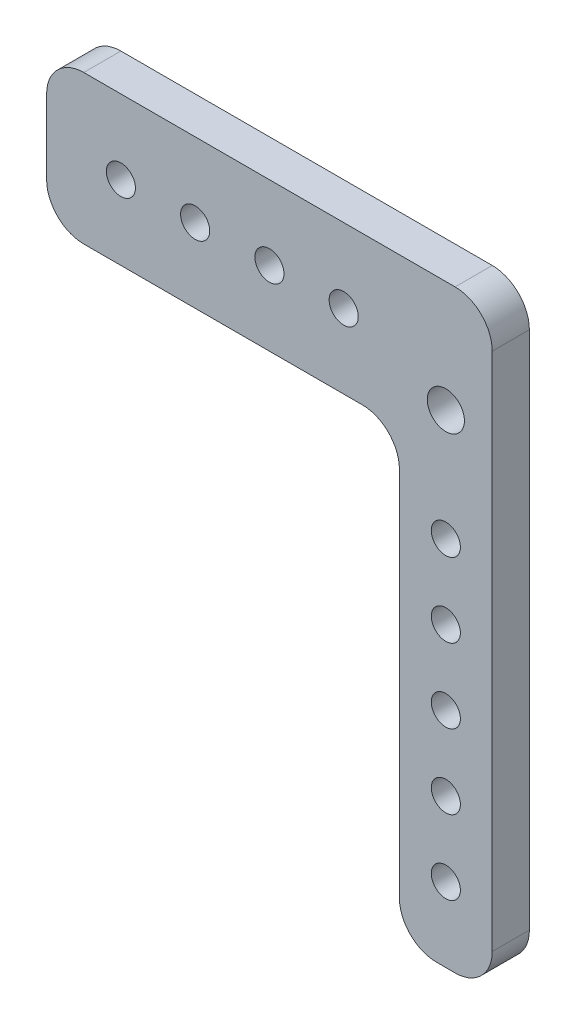
ISO-10303-21;
HEADER;
FILE_DESCRIPTION(('STEP AP214'),'2;1');
FILE_NAME('part.step','',(''),(''),'','','');
FILE_SCHEMA(('AUTOMOTIVE_DESIGN { 1 0 10303 214 1 1 1 1 }'));
ENDSEC;
DATA;
#1=APPLICATION_CONTEXT('core data for automotive mechanical design processes');
#2=APPLICATION_PROTOCOL_DEFINITION('international standard','automotive_design',2000,#1);
#3=PRODUCT_CONTEXT('',#1,'mechanical');
#4=PRODUCT('Part','Part','',(#3));
#5=PRODUCT_RELATED_PRODUCT_CATEGORY('part','',(#4));
#6=PRODUCT_DEFINITION_FORMATION('','',#4);
#7=PRODUCT_DEFINITION_CONTEXT('part definition',#1,'design');
#8=PRODUCT_DEFINITION('design','',#6,#7);
#9=PRODUCT_DEFINITION_SHAPE('','',#8);
#10=(LENGTH_UNIT() NAMED_UNIT(*) SI_UNIT(.MILLI.,.METRE.));
#11=(NAMED_UNIT(*) PLANE_ANGLE_UNIT() SI_UNIT($,.RADIAN.));
#12=(NAMED_UNIT(*) SI_UNIT($,.STERADIAN.) SOLID_ANGLE_UNIT());
#13=UNCERTAINTY_MEASURE_WITH_UNIT(LENGTH_MEASURE(1.E-05),#10,'distance_accuracy_value','');
#14=(GEOMETRIC_REPRESENTATION_CONTEXT(3) GLOBAL_UNCERTAINTY_ASSIGNED_CONTEXT((#13)) GLOBAL_UNIT_ASSIGNED_CONTEXT((#10,
#11,#12)) REPRESENTATION_CONTEXT('',''));
#15=CARTESIAN_POINT('',(0.,0.,0.));
#16=DIRECTION('',(0.,0.,1.));
#17=DIRECTION('',(1.,0.,0.));
#18=AXIS2_PLACEMENT_3D('',#15,#16,#17);
#19=CARTESIAN_POINT('',(0.,0.,3.175));
#20=DIRECTION('',(0.,0.,-1.));
#21=DIRECTION('',(-1.,0.,0.));
#22=AXIS2_PLACEMENT_3D('',#19,#20,#21);
#23=PLANE('',#22);
#24=DIRECTION('',(0.,-1.,0.));
#25=VECTOR('',#24,1.);
#26=CARTESIAN_POINT('',(193.675,2444.75,3.175));
#27=LINE('',#26,#25);
#28=CARTESIAN_POINT('',(193.675,2463.8,3.175));
#29=VERTEX_POINT('',#28);
#30=CARTESIAN_POINT('',(193.675,2451.1,3.175));
#31=VERTEX_POINT('',#30);
#32=EDGE_CURVE('E168',#29,#31,#27,.T.);
#33=ORIENTED_EDGE('',*,*,#32,.T.);
#34=CARTESIAN_POINT('',(200.025,2451.1,3.175));
#35=DIRECTION('',(0.,0.,-1.));
#36=DIRECTION('',(-1.,0.,0.));
#37=AXIS2_PLACEMENT_3D('',#34,#35,#36);
#38=CIRCLE('',#37,6.35);
#39=CARTESIAN_POINT('',(200.025,2444.75,3.175));
#40=VERTEX_POINT('',#39);
#41=EDGE_CURVE('E195',#31,#40,#38,.F.);
#42=ORIENTED_EDGE('',*,*,#41,.T.);
#43=DIRECTION('',(1.,0.,0.));
#44=VECTOR('',#43,1.);
#45=CARTESIAN_POINT('',(254.,2444.75,3.175));
#46=LINE('',#45,#44);
#47=CARTESIAN_POINT('',(247.65,2444.75,3.175));
#48=VERTEX_POINT('',#47);
#49=EDGE_CURVE('E255',#40,#48,#46,.T.);
#50=ORIENTED_EDGE('',*,*,#49,.T.);
#51=CARTESIAN_POINT('',(247.65,2438.4,3.175));
#52=DIRECTION('',(0.,0.,-1.));
#53=DIRECTION('',(-1.,0.,0.));
#54=AXIS2_PLACEMENT_3D('',#51,#52,#53);
#55=CIRCLE('',#54,6.35);
#56=CARTESIAN_POINT('',(254.,2438.4,3.175));
#57=VERTEX_POINT('',#56);
#58=EDGE_CURVE('E11',#48,#57,#55,.T.);
#59=ORIENTED_EDGE('',*,*,#58,.T.);
#60=DIRECTION('',(0.,-1.,0.));
#61=VECTOR('',#60,1.);
#62=CARTESIAN_POINT('',(254.,2368.55,3.175));
#63=LINE('',#62,#61);
#64=CARTESIAN_POINT('',(254.,2374.9,3.175));
#65=VERTEX_POINT('',#64);
#66=EDGE_CURVE('E146',#57,#65,#63,.T.);
#67=ORIENTED_EDGE('',*,*,#66,.T.);
#68=CARTESIAN_POINT('',(260.35,2374.9,3.175));
#69=DIRECTION('',(0.,0.,-1.));
#70=DIRECTION('',(-1.,0.,0.));
#71=AXIS2_PLACEMENT_3D('',#68,#69,#70);
#72=CIRCLE('',#71,6.35);
#73=CARTESIAN_POINT('',(260.35,2368.55,3.175));
#74=VERTEX_POINT('',#73);
#75=EDGE_CURVE('E189',#65,#74,#72,.F.);
#76=ORIENTED_EDGE('',*,*,#75,.T.);
#77=DIRECTION('',(1.,0.,0.));
#78=VECTOR('',#77,1.);
#79=CARTESIAN_POINT('',(269.875,2368.55,3.175));
#80=LINE('',#79,#78);
#81=CARTESIAN_POINT('',(263.525,2368.55,3.175));
#82=VERTEX_POINT('',#81);
#83=EDGE_CURVE('E214',#74,#82,#80,.T.);
#84=ORIENTED_EDGE('',*,*,#83,.T.);
#85=CARTESIAN_POINT('',(263.525,2374.9,3.175));
#86=DIRECTION('',(0.,0.,-1.));
#87=DIRECTION('',(-1.,0.,0.));
#88=AXIS2_PLACEMENT_3D('',#85,#86,#87);
#89=CIRCLE('',#88,6.35);
#90=CARTESIAN_POINT('',(269.875,2374.9,3.175));
#91=VERTEX_POINT('',#90);
#92=EDGE_CURVE('E191',#82,#91,#89,.F.);
#93=ORIENTED_EDGE('',*,*,#92,.T.);
#94=DIRECTION('',(0.,1.,0.));
#95=VECTOR('',#94,1.);
#96=CARTESIAN_POINT('',(269.875,2470.15,3.175));
#97=LINE('',#96,#95);
#98=CARTESIAN_POINT('',(269.875,2463.8,3.175));
#99=VERTEX_POINT('',#98);
#100=EDGE_CURVE('E222',#91,#99,#97,.T.);
#101=ORIENTED_EDGE('',*,*,#100,.T.);
#102=CARTESIAN_POINT('',(263.525,2463.8,3.175));
#103=DIRECTION('',(0.,0.,-1.));
#104=DIRECTION('',(-1.,0.,0.));
#105=AXIS2_PLACEMENT_3D('',#102,#103,#104);
#106=CIRCLE('',#105,6.35);
#107=CARTESIAN_POINT('',(263.525,2470.15,3.175));
#108=VERTEX_POINT('',#107);
#109=EDGE_CURVE('E61',#99,#108,#106,.F.);
#110=ORIENTED_EDGE('',*,*,#109,.T.);
#111=DIRECTION('',(-1.,0.,0.));
#112=VECTOR('',#111,1.);
#113=CARTESIAN_POINT('',(193.675,2470.15,3.175));
#114=LINE('',#113,#112);
#115=CARTESIAN_POINT('',(200.025,2470.15,3.175));
#116=VERTEX_POINT('',#115);
#117=EDGE_CURVE('E169',#108,#116,#114,.T.);
#118=ORIENTED_EDGE('',*,*,#117,.T.);
#119=CARTESIAN_POINT('',(200.025,2463.8,3.175));
#120=DIRECTION('',(0.,0.,-1.));
#121=DIRECTION('',(-1.,0.,0.));
#122=AXIS2_PLACEMENT_3D('',#119,#120,#121);
#123=CIRCLE('',#122,6.35);
#124=EDGE_CURVE('E193',#116,#29,#123,.F.);
#125=ORIENTED_EDGE('',*,*,#124,.T.);
#126=EDGE_LOOP('',(#33,#42,#50,#59,#67,#76,#84,#93,#101,#110,#118,#125));
#127=FACE_BOUND('',#126,.T.);
#128=CARTESIAN_POINT('',(261.9375,2451.1,3.175));
#129=DIRECTION('',(0.,0.,1.));
#130=DIRECTION('',(1.,0.,0.));
#131=AXIS2_PLACEMENT_3D('',#128,#129,#130);
#132=CIRCLE('',#131,3.17499999999967);
#133=CARTESIAN_POINT('',(265.1125,2451.1,3.175));
#134=VERTEX_POINT('',#133);
#135=EDGE_CURVE('E238',#134,#134,#132,.T.);
#136=ORIENTED_EDGE('',*,*,#135,.F.);
#137=EDGE_LOOP('',(#136));
#138=FACE_BOUND('',#137,.T.);
#139=CARTESIAN_POINT('',(261.9375,2381.25,3.175));
#140=DIRECTION('',(0.,0.,1.));
#141=DIRECTION('',(1.,0.,0.));
#142=AXIS2_PLACEMENT_3D('',#139,#140,#141);
#143=CIRCLE('',#142,2.4891999999998);
#144=CARTESIAN_POINT('',(264.4267,2381.25,3.175));
#145=VERTEX_POINT('',#144);
#146=EDGE_CURVE('E248',#145,#145,#143,.T.);
#147=ORIENTED_EDGE('',*,*,#146,.F.);
#148=EDGE_LOOP('',(#147));
#149=FACE_BOUND('',#148,.T.);
#150=CARTESIAN_POINT('',(206.375,2457.45,3.175));
#151=DIRECTION('',(0.,0.,1.));
#152=DIRECTION('',(1.,0.,0.));
#153=AXIS2_PLACEMENT_3D('',#150,#151,#152);
#154=CIRCLE('',#153,2.48919999999975);
#155=CARTESIAN_POINT('',(208.8642,2457.45,3.175));
#156=VERTEX_POINT('',#155);
#157=EDGE_CURVE('E490',#156,#156,#154,.T.);
#158=ORIENTED_EDGE('',*,*,#157,.F.);
#159=EDGE_LOOP('',(#158));
#160=FACE_BOUND('',#159,.T.);
#161=CARTESIAN_POINT('',(261.9375,2393.95,3.175));
#162=DIRECTION('',(0.,0.,1.));
#163=DIRECTION('',(1.,0.,0.));
#164=AXIS2_PLACEMENT_3D('',#161,#162,#163);
#165=CIRCLE('',#164,2.4891999999998);
#166=CARTESIAN_POINT('',(264.4267,2393.95,3.175));
#167=VERTEX_POINT('',#166);
#168=EDGE_CURVE('E496',#167,#167,#165,.T.);
#169=ORIENTED_EDGE('',*,*,#168,.F.);
#170=EDGE_LOOP('',(#169));
#171=FACE_BOUND('',#170,.T.);
#172=CARTESIAN_POINT('',(261.9375,2406.65,3.175));
#173=DIRECTION('',(0.,0.,1.));
#174=DIRECTION('',(1.,0.,0.));
#175=AXIS2_PLACEMENT_3D('',#172,#173,#174);
#176=CIRCLE('',#175,2.4891999999998);
#177=CARTESIAN_POINT('',(264.4267,2406.65,3.175));
#178=VERTEX_POINT('',#177);
#179=EDGE_CURVE('E502',#178,#178,#176,.T.);
#180=ORIENTED_EDGE('',*,*,#179,.F.);
#181=EDGE_LOOP('',(#180));
#182=FACE_BOUND('',#181,.T.);
#183=CARTESIAN_POINT('',(261.9375,2419.35,3.175));
#184=DIRECTION('',(0.,0.,1.));
#185=DIRECTION('',(1.,0.,0.));
#186=AXIS2_PLACEMENT_3D('',#183,#184,#185);
#187=CIRCLE('',#186,2.4891999999998);
#188=CARTESIAN_POINT('',(264.4267,2419.35,3.175));
#189=VERTEX_POINT('',#188);
#190=EDGE_CURVE('E508',#189,#189,#187,.T.);
#191=ORIENTED_EDGE('',*,*,#190,.F.);
#192=EDGE_LOOP('',(#191));
#193=FACE_BOUND('',#192,.T.);
#194=CARTESIAN_POINT('',(261.9375,2432.05,3.175));
#195=DIRECTION('',(0.,0.,1.));
#196=DIRECTION('',(1.,0.,0.));
#197=AXIS2_PLACEMENT_3D('',#194,#195,#196);
#198=CIRCLE('',#197,2.4891999999998);
#199=CARTESIAN_POINT('',(264.4267,2432.05,3.175));
#200=VERTEX_POINT('',#199);
#201=EDGE_CURVE('E514',#200,#200,#198,.T.);
#202=ORIENTED_EDGE('',*,*,#201,.F.);
#203=EDGE_LOOP('',(#202));
#204=FACE_BOUND('',#203,.T.);
#205=CARTESIAN_POINT('',(219.075,2457.45,3.175));
#206=DIRECTION('',(0.,0.,1.));
#207=DIRECTION('',(1.,0.,0.));
#208=AXIS2_PLACEMENT_3D('',#205,#206,#207);
#209=CIRCLE('',#208,2.48919999999975);
#210=CARTESIAN_POINT('',(221.5642,2457.45,3.175));
#211=VERTEX_POINT('',#210);
#212=EDGE_CURVE('E520',#211,#211,#209,.T.);
#213=ORIENTED_EDGE('',*,*,#212,.F.);
#214=EDGE_LOOP('',(#213));
#215=FACE_BOUND('',#214,.T.);
#216=CARTESIAN_POINT('',(231.775,2457.45,3.175));
#217=DIRECTION('',(0.,0.,1.));
#218=DIRECTION('',(1.,0.,0.));
#219=AXIS2_PLACEMENT_3D('',#216,#217,#218);
#220=CIRCLE('',#219,2.48919999999975);
#221=CARTESIAN_POINT('',(234.2642,2457.45,3.175));
#222=VERTEX_POINT('',#221);
#223=EDGE_CURVE('E526',#222,#222,#220,.T.);
#224=ORIENTED_EDGE('',*,*,#223,.F.);
#225=EDGE_LOOP('',(#224));
#226=FACE_BOUND('',#225,.T.);
#227=CARTESIAN_POINT('',(244.475,2457.45,3.175));
#228=DIRECTION('',(0.,0.,1.));
#229=DIRECTION('',(1.,0.,0.));
#230=AXIS2_PLACEMENT_3D('',#227,#228,#229);
#231=CIRCLE('',#230,2.48919999999975);
#232=CARTESIAN_POINT('',(246.9642,2457.45,3.175));
#233=VERTEX_POINT('',#232);
#234=EDGE_CURVE('E532',#233,#233,#231,.T.);
#235=ORIENTED_EDGE('',*,*,#234,.F.);
#236=EDGE_LOOP('',(#235));
#237=FACE_BOUND('',#236,.T.);
#238=ADVANCED_FACE('F39',(#127,#138,#149,#160,#171,#182,#193,#204,#215,#226,#237),#23,.F.);
#239=CARTESIAN_POINT('',(0.,0.,-3.175));
#240=DIRECTION('',(0.,0.,-1.));
#241=DIRECTION('',(-1.,0.,0.));
#242=AXIS2_PLACEMENT_3D('',#239,#240,#241);
#243=PLANE('',#242);
#244=CARTESIAN_POINT('',(231.775,2457.45,-3.175));
#245=DIRECTION('',(0.,0.,1.));
#246=DIRECTION('',(1.,0.,0.));
#247=AXIS2_PLACEMENT_3D('',#244,#245,#246);
#248=CIRCLE('',#247,2.48919999999975);
#249=CARTESIAN_POINT('',(234.2642,2457.45,-3.175));
#250=VERTEX_POINT('',#249);
#251=EDGE_CURVE('E529',#250,#250,#248,.T.);
#252=ORIENTED_EDGE('',*,*,#251,.T.);
#253=EDGE_LOOP('',(#252));
#254=FACE_BOUND('',#253,.T.);
#255=CARTESIAN_POINT('',(261.9375,2432.05,-3.175));
#256=DIRECTION('',(0.,0.,1.));
#257=DIRECTION('',(1.,0.,0.));
#258=AXIS2_PLACEMENT_3D('',#255,#256,#257);
#259=CIRCLE('',#258,2.4891999999998);
#260=CARTESIAN_POINT('',(264.4267,2432.05,-3.175));
#261=VERTEX_POINT('',#260);
#262=EDGE_CURVE('E517',#261,#261,#259,.T.);
#263=ORIENTED_EDGE('',*,*,#262,.T.);
#264=EDGE_LOOP('',(#263));
#265=FACE_BOUND('',#264,.T.);
#266=CARTESIAN_POINT('',(261.9375,2406.65,-3.175));
#267=DIRECTION('',(0.,0.,1.));
#268=DIRECTION('',(1.,0.,0.));
#269=AXIS2_PLACEMENT_3D('',#266,#267,#268);
#270=CIRCLE('',#269,2.4891999999998);
#271=CARTESIAN_POINT('',(264.4267,2406.65,-3.175));
#272=VERTEX_POINT('',#271);
#273=EDGE_CURVE('E505',#272,#272,#270,.T.);
#274=ORIENTED_EDGE('',*,*,#273,.T.);
#275=EDGE_LOOP('',(#274));
#276=FACE_BOUND('',#275,.T.);
#277=CARTESIAN_POINT('',(206.375,2457.45,-3.175));
#278=DIRECTION('',(0.,0.,1.));
#279=DIRECTION('',(1.,0.,0.));
#280=AXIS2_PLACEMENT_3D('',#277,#278,#279);
#281=CIRCLE('',#280,2.48919999999975);
#282=CARTESIAN_POINT('',(208.8642,2457.45,-3.175));
#283=VERTEX_POINT('',#282);
#284=EDGE_CURVE('E492',#283,#283,#281,.T.);
#285=ORIENTED_EDGE('',*,*,#284,.T.);
#286=EDGE_LOOP('',(#285));
#287=FACE_BOUND('',#286,.T.);
#288=CARTESIAN_POINT('',(261.9375,2451.1,-3.175));
#289=DIRECTION('',(0.,0.,1.));
#290=DIRECTION('',(1.,0.,0.));
#291=AXIS2_PLACEMENT_3D('',#288,#289,#290);
#292=CIRCLE('',#291,3.17499999999967);
#293=CARTESIAN_POINT('',(265.1125,2451.1,-3.175));
#294=VERTEX_POINT('',#293);
#295=EDGE_CURVE('E243',#294,#294,#292,.T.);
#296=ORIENTED_EDGE('',*,*,#295,.T.);
#297=EDGE_LOOP('',(#296));
#298=FACE_BOUND('',#297,.T.);
#299=DIRECTION('',(1.,0.,0.));
#300=VECTOR('',#299,1.);
#301=CARTESIAN_POINT('',(254.,2444.75,-3.175));
#302=LINE('',#301,#300);
#303=CARTESIAN_POINT('',(200.025,2444.75,-3.175));
#304=VERTEX_POINT('',#303);
#305=CARTESIAN_POINT('',(247.65,2444.75,-3.175));
#306=VERTEX_POINT('',#305);
#307=EDGE_CURVE('E155',#304,#306,#302,.T.);
#308=ORIENTED_EDGE('',*,*,#307,.F.);
#309=CARTESIAN_POINT('',(200.025,2451.1,-3.175));
#310=DIRECTION('',(0.,0.,-1.));
#311=DIRECTION('',(-1.,0.,0.));
#312=AXIS2_PLACEMENT_3D('',#309,#310,#311);
#313=CIRCLE('',#312,6.35);
#314=CARTESIAN_POINT('',(193.675,2451.1,-3.175));
#315=VERTEX_POINT('',#314);
#316=EDGE_CURVE('E181',#304,#315,#313,.T.);
#317=ORIENTED_EDGE('',*,*,#316,.T.);
#318=DIRECTION('',(0.,-1.,0.));
#319=VECTOR('',#318,1.);
#320=CARTESIAN_POINT('',(193.675,2444.75,-3.175));
#321=LINE('',#320,#319);
#322=CARTESIAN_POINT('',(193.675,2463.8,-3.175));
#323=VERTEX_POINT('',#322);
#324=EDGE_CURVE('E160',#323,#315,#321,.T.);
#325=ORIENTED_EDGE('',*,*,#324,.F.);
#326=CARTESIAN_POINT('',(200.025,2463.8,-3.175));
#327=DIRECTION('',(0.,0.,-1.));
#328=DIRECTION('',(-1.,0.,0.));
#329=AXIS2_PLACEMENT_3D('',#326,#327,#328);
#330=CIRCLE('',#329,6.35);
#331=CARTESIAN_POINT('',(200.025,2470.15,-3.175));
#332=VERTEX_POINT('',#331);
#333=EDGE_CURVE('E179',#323,#332,#330,.T.);
#334=ORIENTED_EDGE('',*,*,#333,.T.);
#335=DIRECTION('',(-1.,0.,0.));
#336=VECTOR('',#335,1.);
#337=CARTESIAN_POINT('',(193.675,2470.15,-3.175));
#338=LINE('',#337,#336);
#339=CARTESIAN_POINT('',(263.525,2470.15,-3.175));
#340=VERTEX_POINT('',#339);
#341=EDGE_CURVE('E166',#340,#332,#338,.T.);
#342=ORIENTED_EDGE('',*,*,#341,.F.);
#343=CARTESIAN_POINT('',(263.525,2463.8,-3.175));
#344=DIRECTION('',(0.,0.,-1.));
#345=DIRECTION('',(-1.,0.,0.));
#346=AXIS2_PLACEMENT_3D('',#343,#344,#345);
#347=CIRCLE('',#346,6.35);
#348=CARTESIAN_POINT('',(269.875,2463.8,-3.175));
#349=VERTEX_POINT('',#348);
#350=EDGE_CURVE('E174',#340,#349,#347,.T.);
#351=ORIENTED_EDGE('',*,*,#350,.T.);
#352=DIRECTION('',(0.,1.,0.));
#353=VECTOR('',#352,1.);
#354=CARTESIAN_POINT('',(269.875,2470.15,-3.175));
#355=LINE('',#354,#353);
#356=CARTESIAN_POINT('',(269.875,2374.9,-3.175));
#357=VERTEX_POINT('',#356);
#358=EDGE_CURVE('E158',#357,#349,#355,.T.);
#359=ORIENTED_EDGE('',*,*,#358,.F.);
#360=CARTESIAN_POINT('',(263.525,2374.9,-3.175));
#361=DIRECTION('',(0.,0.,-1.));
#362=DIRECTION('',(-1.,0.,0.));
#363=AXIS2_PLACEMENT_3D('',#360,#361,#362);
#364=CIRCLE('',#363,6.35);
#365=CARTESIAN_POINT('',(263.525,2368.55,-3.175));
#366=VERTEX_POINT('',#365);
#367=EDGE_CURVE('E177',#357,#366,#364,.T.);
#368=ORIENTED_EDGE('',*,*,#367,.T.);
#369=DIRECTION('',(1.,0.,0.));
#370=VECTOR('',#369,1.);
#371=CARTESIAN_POINT('',(269.875,2368.55,-3.175));
#372=LINE('',#371,#370);
#373=CARTESIAN_POINT('',(260.35,2368.55,-3.175));
#374=VERTEX_POINT('',#373);
#375=EDGE_CURVE('E154',#374,#366,#372,.T.);
#376=ORIENTED_EDGE('',*,*,#375,.F.);
#377=CARTESIAN_POINT('',(260.35,2374.9,-3.175));
#378=DIRECTION('',(0.,0.,-1.));
#379=DIRECTION('',(-1.,0.,0.));
#380=AXIS2_PLACEMENT_3D('',#377,#378,#379);
#381=CIRCLE('',#380,6.35);
#382=CARTESIAN_POINT('',(254.,2374.9,-3.175));
#383=VERTEX_POINT('',#382);
#384=EDGE_CURVE('E153',#374,#383,#381,.T.);
#385=ORIENTED_EDGE('',*,*,#384,.T.);
#386=DIRECTION('',(0.,-1.,0.));
#387=VECTOR('',#386,1.);
#388=CARTESIAN_POINT('',(254.,2368.55,-3.175));
#389=LINE('',#388,#387);
#390=CARTESIAN_POINT('',(254.,2438.4,-3.175));
#391=VERTEX_POINT('',#390);
#392=EDGE_CURVE('E143',#391,#383,#389,.T.);
#393=ORIENTED_EDGE('',*,*,#392,.F.);
#394=CARTESIAN_POINT('',(247.65,2438.4,-3.175));
#395=DIRECTION('',(0.,0.,-1.));
#396=DIRECTION('',(-1.,0.,0.));
#397=AXIS2_PLACEMENT_3D('',#394,#395,#396);
#398=CIRCLE('',#397,6.35);
#399=EDGE_CURVE('E47',#391,#306,#398,.F.);
#400=ORIENTED_EDGE('',*,*,#399,.T.);
#401=EDGE_LOOP('',(#308,#317,#325,#334,#342,#351,#359,#368,#376,#385,#393,#400));
#402=FACE_BOUND('',#401,.T.);
#403=CARTESIAN_POINT('',(261.9375,2381.25,-3.175));
#404=DIRECTION('',(0.,0.,1.));
#405=DIRECTION('',(1.,0.,0.));
#406=AXIS2_PLACEMENT_3D('',#403,#404,#405);
#407=CIRCLE('',#406,2.4891999999998);
#408=CARTESIAN_POINT('',(264.4267,2381.25,-3.175));
#409=VERTEX_POINT('',#408);
#410=EDGE_CURVE('E251',#409,#409,#407,.T.);
#411=ORIENTED_EDGE('',*,*,#410,.T.);
#412=EDGE_LOOP('',(#411));
#413=FACE_BOUND('',#412,.T.);
#414=CARTESIAN_POINT('',(261.9375,2393.95,-3.175));
#415=DIRECTION('',(0.,0.,1.));
#416=DIRECTION('',(1.,0.,0.));
#417=AXIS2_PLACEMENT_3D('',#414,#415,#416);
#418=CIRCLE('',#417,2.4891999999998);
#419=CARTESIAN_POINT('',(264.4267,2393.95,-3.175));
#420=VERTEX_POINT('',#419);
#421=EDGE_CURVE('E499',#420,#420,#418,.T.);
#422=ORIENTED_EDGE('',*,*,#421,.T.);
#423=EDGE_LOOP('',(#422));
#424=FACE_BOUND('',#423,.T.);
#425=CARTESIAN_POINT('',(261.9375,2419.35,-3.175));
#426=DIRECTION('',(0.,0.,1.));
#427=DIRECTION('',(1.,0.,0.));
#428=AXIS2_PLACEMENT_3D('',#425,#426,#427);
#429=CIRCLE('',#428,2.4891999999998);
#430=CARTESIAN_POINT('',(264.4267,2419.35,-3.175));
#431=VERTEX_POINT('',#430);
#432=EDGE_CURVE('E511',#431,#431,#429,.T.);
#433=ORIENTED_EDGE('',*,*,#432,.T.);
#434=EDGE_LOOP('',(#433));
#435=FACE_BOUND('',#434,.T.);
#436=CARTESIAN_POINT('',(219.075,2457.45,-3.175));
#437=DIRECTION('',(0.,0.,1.));
#438=DIRECTION('',(1.,0.,0.));
#439=AXIS2_PLACEMENT_3D('',#436,#437,#438);
#440=CIRCLE('',#439,2.48919999999975);
#441=CARTESIAN_POINT('',(221.5642,2457.45,-3.175));
#442=VERTEX_POINT('',#441);
#443=EDGE_CURVE('E523',#442,#442,#440,.T.);
#444=ORIENTED_EDGE('',*,*,#443,.T.);
#445=EDGE_LOOP('',(#444));
#446=FACE_BOUND('',#445,.T.);
#447=CARTESIAN_POINT('',(244.475,2457.45,-3.175));
#448=DIRECTION('',(0.,0.,1.));
#449=DIRECTION('',(1.,0.,0.));
#450=AXIS2_PLACEMENT_3D('',#447,#448,#449);
#451=CIRCLE('',#450,2.48919999999975);
#452=CARTESIAN_POINT('',(246.9642,2457.45,-3.175));
#453=VERTEX_POINT('',#452);
#454=EDGE_CURVE('E535',#453,#453,#451,.T.);
#455=ORIENTED_EDGE('',*,*,#454,.T.);
#456=EDGE_LOOP('',(#455));
#457=FACE_BOUND('',#456,.T.);
#458=ADVANCED_FACE('F150',(#254,#265,#276,#287,#298,#402,#413,#424,#435,#446,#457),#243,.T.);
#459=CARTESIAN_POINT('',(193.675,2444.75,3.175));
#460=DIRECTION('',(1.,0.,0.));
#461=DIRECTION('',(0.,1.,0.));
#462=AXIS2_PLACEMENT_3D('',#459,#460,#461);
#463=PLANE('',#462);
#464=ORIENTED_EDGE('',*,*,#324,.T.);
#465=DIRECTION('',(0.,0.,-1.));
#466=VECTOR('',#465,1.);
#467=CARTESIAN_POINT('',(193.675,2451.1,3.175));
#468=LINE('',#467,#466);
#469=EDGE_CURVE('E186',#315,#31,#468,.F.);
#470=ORIENTED_EDGE('',*,*,#469,.T.);
#471=ORIENTED_EDGE('',*,*,#32,.F.);
#472=DIRECTION('',(0.,0.,-1.));
#473=VECTOR('',#472,1.);
#474=CARTESIAN_POINT('',(193.675,2463.8,3.175));
#475=LINE('',#474,#473);
#476=EDGE_CURVE('E183',#29,#323,#475,.T.);
#477=ORIENTED_EDGE('',*,*,#476,.T.);
#478=EDGE_LOOP('',(#464,#470,#471,#477));
#479=FACE_BOUND('',#478,.T.);
#480=ADVANCED_FACE('F273',(#479),#463,.F.);
#481=CARTESIAN_POINT('',(254.,2444.75,3.175));
#482=DIRECTION('',(0.,1.,0.));
#483=DIRECTION('',(0.,0.,1.));
#484=AXIS2_PLACEMENT_3D('',#481,#482,#483);
#485=PLANE('',#484);
#486=ORIENTED_EDGE('',*,*,#307,.T.);
#487=DIRECTION('',(0.,0.,-1.));
#488=VECTOR('',#487,1.);
#489=CARTESIAN_POINT('',(247.65,2444.75,3.175));
#490=LINE('',#489,#488);
#491=EDGE_CURVE('E133',#306,#48,#490,.F.);
#492=ORIENTED_EDGE('',*,*,#491,.T.);
#493=ORIENTED_EDGE('',*,*,#49,.F.);
#494=DIRECTION('',(0.,0.,-1.));
#495=VECTOR('',#494,1.);
#496=CARTESIAN_POINT('',(200.025,2444.75,3.175));
#497=LINE('',#496,#495);
#498=EDGE_CURVE('E147',#40,#304,#497,.T.);
#499=ORIENTED_EDGE('',*,*,#498,.T.);
#500=EDGE_LOOP('',(#486,#492,#493,#499));
#501=FACE_BOUND('',#500,.T.);
#502=ADVANCED_FACE('F288',(#501),#485,.F.);
#503=CARTESIAN_POINT('',(254.,2368.55,3.175));
#504=DIRECTION('',(1.,0.,0.));
#505=DIRECTION('',(0.,1.,0.));
#506=AXIS2_PLACEMENT_3D('',#503,#504,#505);
#507=PLANE('',#506);
#508=ORIENTED_EDGE('',*,*,#66,.F.);
#509=DIRECTION('',(0.,0.,-1.));
#510=VECTOR('',#509,1.);
#511=CARTESIAN_POINT('',(254.,2438.4,-3.175));
#512=LINE('',#511,#510);
#513=EDGE_CURVE('E132',#57,#391,#512,.T.);
#514=ORIENTED_EDGE('',*,*,#513,.T.);
#515=ORIENTED_EDGE('',*,*,#392,.T.);
#516=DIRECTION('',(0.,0.,-1.));
#517=VECTOR('',#516,1.);
#518=CARTESIAN_POINT('',(254.,2374.9,3.175));
#519=LINE('',#518,#517);
#520=EDGE_CURVE('E148',#383,#65,#519,.F.);
#521=ORIENTED_EDGE('',*,*,#520,.T.);
#522=EDGE_LOOP('',(#508,#514,#515,#521));
#523=FACE_BOUND('',#522,.T.);
#524=ADVANCED_FACE('F142',(#523),#507,.F.);
#525=CARTESIAN_POINT('',(269.875,2368.55,3.175));
#526=DIRECTION('',(0.,1.,0.));
#527=DIRECTION('',(0.,0.,1.));
#528=AXIS2_PLACEMENT_3D('',#525,#526,#527);
#529=PLANE('',#528);
#530=ORIENTED_EDGE('',*,*,#375,.T.);
#531=DIRECTION('',(0.,0.,-1.));
#532=VECTOR('',#531,1.);
#533=CARTESIAN_POINT('',(263.525,2368.55,3.175));
#534=LINE('',#533,#532);
#535=EDGE_CURVE('E138',#366,#82,#534,.F.);
#536=ORIENTED_EDGE('',*,*,#535,.T.);
#537=ORIENTED_EDGE('',*,*,#83,.F.);
#538=DIRECTION('',(0.,0.,-1.));
#539=VECTOR('',#538,1.);
#540=CARTESIAN_POINT('',(260.35,2368.55,3.175));
#541=LINE('',#540,#539);
#542=EDGE_CURVE('E206',#74,#374,#541,.T.);
#543=ORIENTED_EDGE('',*,*,#542,.T.);
#544=EDGE_LOOP('',(#530,#536,#537,#543));
#545=FACE_BOUND('',#544,.T.);
#546=ADVANCED_FACE('F213',(#545),#529,.F.);
#547=CARTESIAN_POINT('',(269.875,2470.15,3.175));
#548=DIRECTION('',(-1.,0.,0.));
#549=DIRECTION('',(0.,-1.,0.));
#550=AXIS2_PLACEMENT_3D('',#547,#548,#549);
#551=PLANE('',#550);
#552=ORIENTED_EDGE('',*,*,#100,.F.);
#553=DIRECTION('',(0.,0.,-1.));
#554=VECTOR('',#553,1.);
#555=CARTESIAN_POINT('',(269.875,2374.9,3.175));
#556=LINE('',#555,#554);
#557=EDGE_CURVE('E203',#91,#357,#556,.T.);
#558=ORIENTED_EDGE('',*,*,#557,.T.);
#559=ORIENTED_EDGE('',*,*,#358,.T.);
#560=DIRECTION('',(0.,0.,-1.));
#561=VECTOR('',#560,1.);
#562=CARTESIAN_POINT('',(269.875,2463.8,3.175));
#563=LINE('',#562,#561);
#564=EDGE_CURVE('E201',#349,#99,#563,.F.);
#565=ORIENTED_EDGE('',*,*,#564,.T.);
#566=EDGE_LOOP('',(#552,#558,#559,#565));
#567=FACE_BOUND('',#566,.T.);
#568=ADVANCED_FACE('F228',(#567),#551,.F.);
#569=CARTESIAN_POINT('',(193.675,2470.15,3.175));
#570=DIRECTION('',(0.,-1.,0.));
#571=DIRECTION('',(0.,0.,-1.));
#572=AXIS2_PLACEMENT_3D('',#569,#570,#571);
#573=PLANE('',#572);
#574=ORIENTED_EDGE('',*,*,#341,.T.);
#575=DIRECTION('',(0.,0.,-1.));
#576=VECTOR('',#575,1.);
#577=CARTESIAN_POINT('',(200.025,2470.15,3.175));
#578=LINE('',#577,#576);
#579=EDGE_CURVE('E54',#332,#116,#578,.F.);
#580=ORIENTED_EDGE('',*,*,#579,.T.);
#581=ORIENTED_EDGE('',*,*,#117,.F.);
#582=DIRECTION('',(0.,0.,-1.));
#583=VECTOR('',#582,1.);
#584=CARTESIAN_POINT('',(263.525,2470.15,3.175));
#585=LINE('',#584,#583);
#586=EDGE_CURVE('E197',#108,#340,#585,.T.);
#587=ORIENTED_EDGE('',*,*,#586,.T.);
#588=EDGE_LOOP('',(#574,#580,#581,#587));
#589=FACE_BOUND('',#588,.T.);
#590=ADVANCED_FACE('F233',(#589),#573,.F.);
#591=CARTESIAN_POINT('',(261.9375,2451.1,3.175));
#592=DIRECTION('',(0.,0.,-1.));
#593=DIRECTION('',(-1.,0.,0.));
#594=AXIS2_PLACEMENT_3D('',#591,#592,#593);
#595=CYLINDRICAL_SURFACE('',#594,3.17499999999967);
#596=ORIENTED_EDGE('',*,*,#135,.T.);
#597=EDGE_LOOP('',(#596));
#598=FACE_BOUND('',#597,.T.);
#599=ORIENTED_EDGE('',*,*,#295,.F.);
#600=EDGE_LOOP('',(#599));
#601=FACE_BOUND('',#600,.T.);
#602=ADVANCED_FACE('F277',(#598,#601),#595,.F.);
#603=CARTESIAN_POINT('',(261.9375,2381.25,3.175));
#604=DIRECTION('',(0.,0.,-1.));
#605=DIRECTION('',(-1.,0.,0.));
#606=AXIS2_PLACEMENT_3D('',#603,#604,#605);
#607=CYLINDRICAL_SURFACE('',#606,2.4891999999998);
#608=ORIENTED_EDGE('',*,*,#146,.T.);
#609=EDGE_LOOP('',(#608));
#610=FACE_BOUND('',#609,.T.);
#611=ORIENTED_EDGE('',*,*,#410,.F.);
#612=EDGE_LOOP('',(#611));
#613=FACE_BOUND('',#612,.T.);
#614=ADVANCED_FACE('F408',(#610,#613),#607,.F.);
#615=CARTESIAN_POINT('',(206.375,2457.45,3.175));
#616=DIRECTION('',(0.,0.,-1.));
#617=DIRECTION('',(-1.,0.,0.));
#618=AXIS2_PLACEMENT_3D('',#615,#616,#617);
#619=CYLINDRICAL_SURFACE('',#618,2.48919999999975);
#620=ORIENTED_EDGE('',*,*,#157,.T.);
#621=EDGE_LOOP('',(#620));
#622=FACE_BOUND('',#621,.T.);
#623=ORIENTED_EDGE('',*,*,#284,.F.);
#624=EDGE_LOOP('',(#623));
#625=FACE_BOUND('',#624,.T.);
#626=ADVANCED_FACE('F399',(#622,#625),#619,.F.);
#627=CARTESIAN_POINT('',(261.9375,2393.95,3.175));
#628=DIRECTION('',(0.,0.,-1.));
#629=DIRECTION('',(-1.,0.,0.));
#630=AXIS2_PLACEMENT_3D('',#627,#628,#629);
#631=CYLINDRICAL_SURFACE('',#630,2.4891999999998);
#632=ORIENTED_EDGE('',*,*,#168,.T.);
#633=EDGE_LOOP('',(#632));
#634=FACE_BOUND('',#633,.T.);
#635=ORIENTED_EDGE('',*,*,#421,.F.);
#636=EDGE_LOOP('',(#635));
#637=FACE_BOUND('',#636,.T.);
#638=ADVANCED_FACE('F390',(#634,#637),#631,.F.);
#639=CARTESIAN_POINT('',(261.9375,2406.65,3.175));
#640=DIRECTION('',(0.,0.,-1.));
#641=DIRECTION('',(-1.,0.,0.));
#642=AXIS2_PLACEMENT_3D('',#639,#640,#641);
#643=CYLINDRICAL_SURFACE('',#642,2.4891999999998);
#644=ORIENTED_EDGE('',*,*,#179,.T.);
#645=EDGE_LOOP('',(#644));
#646=FACE_BOUND('',#645,.T.);
#647=ORIENTED_EDGE('',*,*,#273,.F.);
#648=EDGE_LOOP('',(#647));
#649=FACE_BOUND('',#648,.T.);
#650=ADVANCED_FACE('F381',(#646,#649),#643,.F.);
#651=CARTESIAN_POINT('',(261.9375,2419.35,3.175));
#652=DIRECTION('',(0.,0.,-1.));
#653=DIRECTION('',(-1.,0.,0.));
#654=AXIS2_PLACEMENT_3D('',#651,#652,#653);
#655=CYLINDRICAL_SURFACE('',#654,2.4891999999998);
#656=ORIENTED_EDGE('',*,*,#190,.T.);
#657=EDGE_LOOP('',(#656));
#658=FACE_BOUND('',#657,.T.);
#659=ORIENTED_EDGE('',*,*,#432,.F.);
#660=EDGE_LOOP('',(#659));
#661=FACE_BOUND('',#660,.T.);
#662=ADVANCED_FACE('F372',(#658,#661),#655,.F.);
#663=CARTESIAN_POINT('',(261.9375,2432.05,3.175));
#664=DIRECTION('',(0.,0.,-1.));
#665=DIRECTION('',(-1.,0.,0.));
#666=AXIS2_PLACEMENT_3D('',#663,#664,#665);
#667=CYLINDRICAL_SURFACE('',#666,2.4891999999998);
#668=ORIENTED_EDGE('',*,*,#201,.T.);
#669=EDGE_LOOP('',(#668));
#670=FACE_BOUND('',#669,.T.);
#671=ORIENTED_EDGE('',*,*,#262,.F.);
#672=EDGE_LOOP('',(#671));
#673=FACE_BOUND('',#672,.T.);
#674=ADVANCED_FACE('F363',(#670,#673),#667,.F.);
#675=CARTESIAN_POINT('',(219.075,2457.45,3.175));
#676=DIRECTION('',(0.,0.,-1.));
#677=DIRECTION('',(-1.,0.,0.));
#678=AXIS2_PLACEMENT_3D('',#675,#676,#677);
#679=CYLINDRICAL_SURFACE('',#678,2.48919999999975);
#680=ORIENTED_EDGE('',*,*,#212,.T.);
#681=EDGE_LOOP('',(#680));
#682=FACE_BOUND('',#681,.T.);
#683=ORIENTED_EDGE('',*,*,#443,.F.);
#684=EDGE_LOOP('',(#683));
#685=FACE_BOUND('',#684,.T.);
#686=ADVANCED_FACE('F354',(#682,#685),#679,.F.);
#687=CARTESIAN_POINT('',(231.775,2457.45,3.175));
#688=DIRECTION('',(0.,0.,-1.));
#689=DIRECTION('',(-1.,0.,0.));
#690=AXIS2_PLACEMENT_3D('',#687,#688,#689);
#691=CYLINDRICAL_SURFACE('',#690,2.48919999999975);
#692=ORIENTED_EDGE('',*,*,#223,.T.);
#693=EDGE_LOOP('',(#692));
#694=FACE_BOUND('',#693,.T.);
#695=ORIENTED_EDGE('',*,*,#251,.F.);
#696=EDGE_LOOP('',(#695));
#697=FACE_BOUND('',#696,.T.);
#698=ADVANCED_FACE('F345',(#694,#697),#691,.F.);
#699=CARTESIAN_POINT('',(244.475,2457.45,3.175));
#700=DIRECTION('',(0.,0.,-1.));
#701=DIRECTION('',(-1.,0.,0.));
#702=AXIS2_PLACEMENT_3D('',#699,#700,#701);
#703=CYLINDRICAL_SURFACE('',#702,2.48919999999975);
#704=ORIENTED_EDGE('',*,*,#234,.T.);
#705=EDGE_LOOP('',(#704));
#706=FACE_BOUND('',#705,.T.);
#707=ORIENTED_EDGE('',*,*,#454,.F.);
#708=EDGE_LOOP('',(#707));
#709=FACE_BOUND('',#708,.T.);
#710=ADVANCED_FACE('F297',(#706,#709),#703,.F.);
#711=CARTESIAN_POINT('',(247.65,2438.4,3.175));
#712=DIRECTION('',(0.,0.,1.));
#713=DIRECTION('',(1.,0.,0.));
#714=AXIS2_PLACEMENT_3D('',#711,#712,#713);
#715=CYLINDRICAL_SURFACE('',#714,6.35);
#716=ORIENTED_EDGE('',*,*,#58,.F.);
#717=ORIENTED_EDGE('',*,*,#491,.F.);
#718=ORIENTED_EDGE('',*,*,#399,.F.);
#719=ORIENTED_EDGE('',*,*,#513,.F.);
#720=EDGE_LOOP('',(#716,#717,#718,#719));
#721=FACE_BOUND('',#720,.T.);
#722=ADVANCED_FACE('F131',(#721),#715,.F.);
#723=CARTESIAN_POINT('',(200.025,2451.1,3.175));
#724=DIRECTION('',(0.,0.,-1.));
#725=DIRECTION('',(-1.,0.,0.));
#726=AXIS2_PLACEMENT_3D('',#723,#724,#725);
#727=CYLINDRICAL_SURFACE('',#726,6.35);
#728=ORIENTED_EDGE('',*,*,#41,.F.);
#729=ORIENTED_EDGE('',*,*,#469,.F.);
#730=ORIENTED_EDGE('',*,*,#316,.F.);
#731=ORIENTED_EDGE('',*,*,#498,.F.);
#732=EDGE_LOOP('',(#728,#729,#730,#731));
#733=FACE_BOUND('',#732,.T.);
#734=ADVANCED_FACE('F296',(#733),#727,.T.);
#735=CARTESIAN_POINT('',(200.025,2463.8,3.175));
#736=DIRECTION('',(0.,0.,-1.));
#737=DIRECTION('',(-1.,0.,0.));
#738=AXIS2_PLACEMENT_3D('',#735,#736,#737);
#739=CYLINDRICAL_SURFACE('',#738,6.35);
#740=ORIENTED_EDGE('',*,*,#124,.F.);
#741=ORIENTED_EDGE('',*,*,#579,.F.);
#742=ORIENTED_EDGE('',*,*,#333,.F.);
#743=ORIENTED_EDGE('',*,*,#476,.F.);
#744=EDGE_LOOP('',(#740,#741,#742,#743));
#745=FACE_BOUND('',#744,.T.);
#746=ADVANCED_FACE('F265',(#745),#739,.T.);
#747=CARTESIAN_POINT('',(263.525,2374.9,3.175));
#748=DIRECTION('',(0.,0.,-1.));
#749=DIRECTION('',(-1.,0.,0.));
#750=AXIS2_PLACEMENT_3D('',#747,#748,#749);
#751=CYLINDRICAL_SURFACE('',#750,6.35);
#752=ORIENTED_EDGE('',*,*,#92,.F.);
#753=ORIENTED_EDGE('',*,*,#535,.F.);
#754=ORIENTED_EDGE('',*,*,#367,.F.);
#755=ORIENTED_EDGE('',*,*,#557,.F.);
#756=EDGE_LOOP('',(#752,#753,#754,#755));
#757=FACE_BOUND('',#756,.T.);
#758=ADVANCED_FACE('F225',(#757),#751,.T.);
#759=CARTESIAN_POINT('',(260.35,2374.9,3.175));
#760=DIRECTION('',(0.,0.,-1.));
#761=DIRECTION('',(-1.,0.,0.));
#762=AXIS2_PLACEMENT_3D('',#759,#760,#761);
#763=CYLINDRICAL_SURFACE('',#762,6.35);
#764=ORIENTED_EDGE('',*,*,#75,.F.);
#765=ORIENTED_EDGE('',*,*,#520,.F.);
#766=ORIENTED_EDGE('',*,*,#384,.F.);
#767=ORIENTED_EDGE('',*,*,#542,.F.);
#768=EDGE_LOOP('',(#764,#765,#766,#767));
#769=FACE_BOUND('',#768,.T.);
#770=ADVANCED_FACE('F259',(#769),#763,.T.);
#771=CARTESIAN_POINT('',(263.525,2463.8,3.175));
#772=DIRECTION('',(0.,0.,-1.));
#773=DIRECTION('',(-1.,0.,0.));
#774=AXIS2_PLACEMENT_3D('',#771,#772,#773);
#775=CYLINDRICAL_SURFACE('',#774,6.35);
#776=ORIENTED_EDGE('',*,*,#109,.F.);
#777=ORIENTED_EDGE('',*,*,#564,.F.);
#778=ORIENTED_EDGE('',*,*,#350,.F.);
#779=ORIENTED_EDGE('',*,*,#586,.F.);
#780=EDGE_LOOP('',(#776,#777,#778,#779));
#781=FACE_BOUND('',#780,.T.);
#782=ADVANCED_FACE('F41',(#781),#775,.T.);
#783=CLOSED_SHELL('',(#238,#458,#480,#502,#524,#546,#568,#590,#602,#614,#626,#638,#650,#662,
#674,#686,#698,#710,#722,#734,#746,#758,#770,#782));
#784=MANIFOLD_SOLID_BREP('B2',#783);
#785=ADVANCED_BREP_SHAPE_REPRESENTATION('',(#18,#784),#14);
#786=SHAPE_DEFINITION_REPRESENTATION(#9,#785);
ENDSEC;
END-ISO-10303-21;
